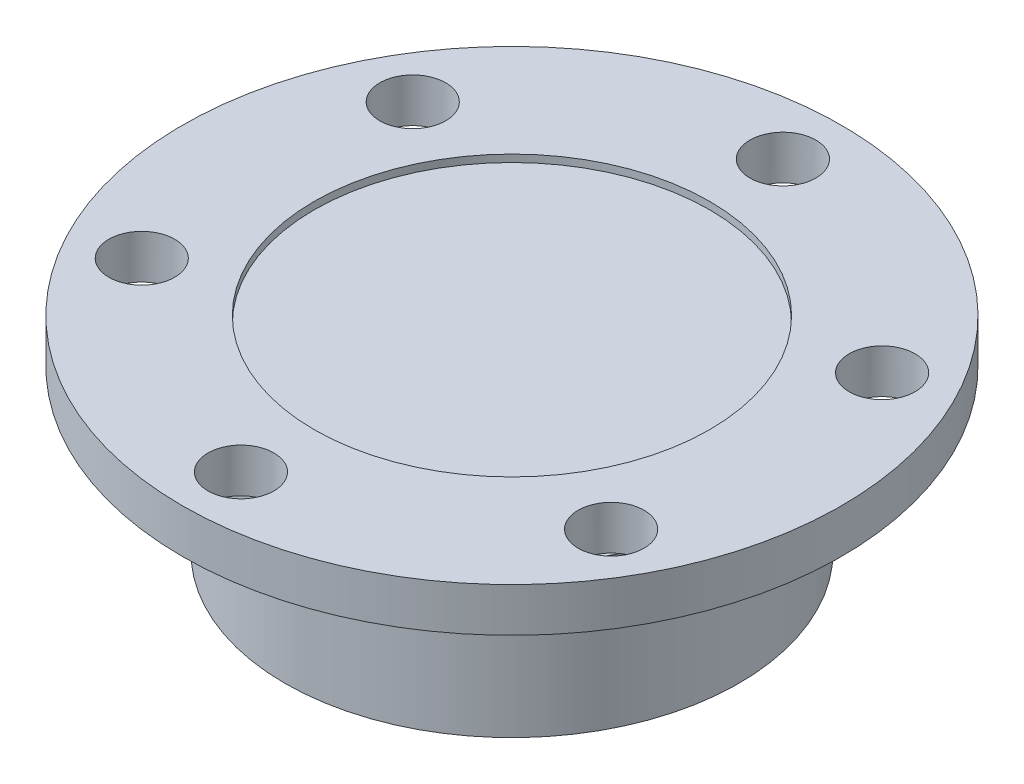
ISO-10303-21;
HEADER;
FILE_DESCRIPTION(('STEP AP214'),'2;1');
FILE_NAME('part.step','',(''),(''),'','','');
FILE_SCHEMA(('AUTOMOTIVE_DESIGN { 1 0 10303 214 1 1 1 1 }'));
ENDSEC;
DATA;
#1=APPLICATION_CONTEXT('core data for automotive mechanical design processes');
#2=APPLICATION_PROTOCOL_DEFINITION('international standard','automotive_design',2000,#1);
#3=PRODUCT_CONTEXT('',#1,'mechanical');
#4=PRODUCT('Part','Part','',(#3));
#5=PRODUCT_RELATED_PRODUCT_CATEGORY('part','',(#4));
#6=PRODUCT_DEFINITION_FORMATION('','',#4);
#7=PRODUCT_DEFINITION_CONTEXT('part definition',#1,'design');
#8=PRODUCT_DEFINITION('design','',#6,#7);
#9=PRODUCT_DEFINITION_SHAPE('','',#8);
#10=(LENGTH_UNIT() NAMED_UNIT(*) SI_UNIT(.MILLI.,.METRE.));
#11=(NAMED_UNIT(*) PLANE_ANGLE_UNIT() SI_UNIT($,.RADIAN.));
#12=(NAMED_UNIT(*) SI_UNIT($,.STERADIAN.) SOLID_ANGLE_UNIT());
#13=UNCERTAINTY_MEASURE_WITH_UNIT(LENGTH_MEASURE(1.E-05),#10,'distance_accuracy_value','');
#14=(GEOMETRIC_REPRESENTATION_CONTEXT(3) GLOBAL_UNCERTAINTY_ASSIGNED_CONTEXT((#13)) GLOBAL_UNIT_ASSIGNED_CONTEXT((#10,
#11,#12)) REPRESENTATION_CONTEXT('',''));
#15=CARTESIAN_POINT('',(0.,0.,0.));
#16=DIRECTION('',(0.,0.,1.));
#17=DIRECTION('',(1.,0.,0.));
#18=AXIS2_PLACEMENT_3D('',#15,#16,#17);
#19=CARTESIAN_POINT('',(-27.,27.,0.));
#20=DIRECTION('',(0.,1.,0.));
#21=DIRECTION('',(0.,0.,1.));
#22=AXIS2_PLACEMENT_3D('',#19,#20,#21);
#23=PLANE('',#22);
#24=CARTESIAN_POINT('',(0.,27.,0.));
#25=DIRECTION('',(0.,1.,0.));
#26=DIRECTION('',(0.,0.,1.));
#27=AXIS2_PLACEMENT_3D('',#24,#25,#26);
#28=CIRCLE('',#27,27.);
#29=CARTESIAN_POINT('',(0.,27.,27.));
#30=VERTEX_POINT('',#29);
#31=EDGE_CURVE('E64',#30,#30,#28,.T.);
#32=ORIENTED_EDGE('',*,*,#31,.T.);
#33=EDGE_LOOP('',(#32));
#34=FACE_BOUND('',#33,.T.);
#35=ADVANCED_FACE('F30',(#34),#23,.T.);
#36=CARTESIAN_POINT('',(-22.,24.5,0.));
#37=DIRECTION('',(0.,-1.,0.));
#38=DIRECTION('',(0.,0.,-1.));
#39=AXIS2_PLACEMENT_3D('',#36,#37,#38);
#40=PLANE('',#39);
#41=CARTESIAN_POINT('',(0.,24.5,0.));
#42=DIRECTION('',(0.,1.,0.));
#43=DIRECTION('',(0.,0.,1.));
#44=AXIS2_PLACEMENT_3D('',#41,#42,#43);
#45=CIRCLE('',#44,22.);
#46=CARTESIAN_POINT('',(0.,24.5,22.));
#47=VERTEX_POINT('',#46);
#48=EDGE_CURVE('E10',#47,#47,#45,.T.);
#49=ORIENTED_EDGE('',*,*,#48,.F.);
#50=EDGE_LOOP('',(#49));
#51=FACE_BOUND('',#50,.T.);
#52=ADVANCED_FACE('F133',(#51),#40,.T.);
#53=CARTESIAN_POINT('',(0.,0.,0.));
#54=DIRECTION('',(0.,-1.,0.));
#55=DIRECTION('',(0.,0.,-1.));
#56=AXIS2_PLACEMENT_3D('',#53,#54,#55);
#57=CONICAL_SURFACE('',#56,26.3200110273573,0.174532925199429);
#58=ORIENTED_EDGE('',*,*,#48,.T.);
#59=EDGE_LOOP('',(#58));
#60=FACE_BOUND('',#59,.T.);
#61=CARTESIAN_POINT('',(0.,0.,0.));
#62=DIRECTION('',(0.,1.,0.));
#63=DIRECTION('',(0.,0.,1.));
#64=AXIS2_PLACEMENT_3D('',#61,#62,#63);
#65=CIRCLE('',#64,26.3200110273573);
#66=CARTESIAN_POINT('',(0.,0.,26.3200110273573));
#67=VERTEX_POINT('',#66);
#68=EDGE_CURVE('E36',#67,#67,#65,.T.);
#69=ORIENTED_EDGE('',*,*,#68,.F.);
#70=EDGE_LOOP('',(#69));
#71=FACE_BOUND('',#70,.T.);
#72=ADVANCED_FACE('F137',(#60,#71),#57,.F.);
#73=CARTESIAN_POINT('',(-31.,0.,0.));
#74=DIRECTION('',(0.,-1.,0.));
#75=DIRECTION('',(0.,0.,-1.));
#76=AXIS2_PLACEMENT_3D('',#73,#74,#75);
#77=PLANE('',#76);
#78=ORIENTED_EDGE('',*,*,#68,.T.);
#79=EDGE_LOOP('',(#78));
#80=FACE_BOUND('',#79,.T.);
#81=CARTESIAN_POINT('',(0.,0.,0.));
#82=DIRECTION('',(0.,1.,0.));
#83=DIRECTION('',(0.,0.,1.));
#84=AXIS2_PLACEMENT_3D('',#81,#82,#83);
#85=CIRCLE('',#84,31.);
#86=CARTESIAN_POINT('',(0.,0.,31.));
#87=VERTEX_POINT('',#86);
#88=EDGE_CURVE('E40',#87,#87,#85,.T.);
#89=ORIENTED_EDGE('',*,*,#88,.F.);
#90=EDGE_LOOP('',(#89));
#91=FACE_BOUND('',#90,.T.);
#92=ADVANCED_FACE('F142',(#80,#91),#77,.T.);
#93=CARTESIAN_POINT('',(0.,30.6187975640425,0.));
#94=DIRECTION('',(0.,1.,0.));
#95=DIRECTION('',(0.,0.,1.));
#96=AXIS2_PLACEMENT_3D('',#93,#94,#95);
#97=CYLINDRICAL_SURFACE('',#96,31.);
#98=ORIENTED_EDGE('',*,*,#88,.T.);
#99=EDGE_LOOP('',(#98));
#100=FACE_BOUND('',#99,.T.);
#101=CARTESIAN_POINT('',(0.,20.5,0.));
#102=DIRECTION('',(0.,1.,0.));
#103=DIRECTION('',(0.,0.,1.));
#104=AXIS2_PLACEMENT_3D('',#101,#102,#103);
#105=CIRCLE('',#104,31.);
#106=CARTESIAN_POINT('',(0.,20.5,31.));
#107=VERTEX_POINT('',#106);
#108=EDGE_CURVE('E44',#107,#107,#105,.T.);
#109=ORIENTED_EDGE('',*,*,#108,.F.);
#110=EDGE_LOOP('',(#109));
#111=FACE_BOUND('',#110,.T.);
#112=ADVANCED_FACE('F147',(#100,#111),#97,.T.);
#113=CARTESIAN_POINT('',(-29.5,20.5,0.));
#114=DIRECTION('',(0.,1.,0.));
#115=DIRECTION('',(0.,0.,1.));
#116=AXIS2_PLACEMENT_3D('',#113,#114,#115);
#117=PLANE('',#116);
#118=ORIENTED_EDGE('',*,*,#108,.T.);
#119=EDGE_LOOP('',(#118));
#120=FACE_BOUND('',#119,.T.);
#121=CARTESIAN_POINT('',(0.,20.5,0.));
#122=DIRECTION('',(0.,1.,0.));
#123=DIRECTION('',(0.,0.,1.));
#124=AXIS2_PLACEMENT_3D('',#121,#122,#123);
#125=CIRCLE('',#124,29.5);
#126=CARTESIAN_POINT('',(0.,20.5,29.5));
#127=VERTEX_POINT('',#126);
#128=EDGE_CURVE('E49',#127,#127,#125,.T.);
#129=ORIENTED_EDGE('',*,*,#128,.F.);
#130=EDGE_LOOP('',(#129));
#131=FACE_BOUND('',#130,.T.);
#132=ADVANCED_FACE('F150',(#120,#131),#117,.T.);
#133=CARTESIAN_POINT('',(0.,30.6187975640425,0.));
#134=DIRECTION('',(0.,1.,0.));
#135=DIRECTION('',(0.,0.,1.));
#136=AXIS2_PLACEMENT_3D('',#133,#134,#135);
#137=CYLINDRICAL_SURFACE('',#136,29.5);
#138=ORIENTED_EDGE('',*,*,#128,.T.);
#139=EDGE_LOOP('',(#138));
#140=FACE_BOUND('',#139,.T.);
#141=CARTESIAN_POINT('',(0.,22.,0.));
#142=DIRECTION('',(0.,1.,0.));
#143=DIRECTION('',(0.,0.,1.));
#144=AXIS2_PLACEMENT_3D('',#141,#142,#143);
#145=CIRCLE('',#144,29.5);
#146=CARTESIAN_POINT('',(0.,22.,29.5));
#147=VERTEX_POINT('',#146);
#148=EDGE_CURVE('E52',#147,#147,#145,.T.);
#149=ORIENTED_EDGE('',*,*,#148,.F.);
#150=EDGE_LOOP('',(#149));
#151=FACE_BOUND('',#150,.T.);
#152=ADVANCED_FACE('F154',(#140,#151),#137,.T.);
#153=CARTESIAN_POINT('',(-45.,22.,0.));
#154=DIRECTION('',(0.,-1.,0.));
#155=DIRECTION('',(0.,0.,-1.));
#156=AXIS2_PLACEMENT_3D('',#153,#154,#155);
#157=PLANE('',#156);
#158=CARTESIAN_POINT('',(0.,22.,-37.));
#159=DIRECTION('',(0.,-1.,0.));
#160=DIRECTION('',(0.,0.,-1.));
#161=AXIS2_PLACEMENT_3D('',#158,#159,#160);
#162=CIRCLE('',#161,4.5);
#163=CARTESIAN_POINT('',(0.,22.,-41.5));
#164=VERTEX_POINT('',#163);
#165=EDGE_CURVE('E93',#164,#164,#162,.F.);
#166=ORIENTED_EDGE('',*,*,#165,.T.);
#167=EDGE_LOOP('',(#166));
#168=FACE_BOUND('',#167,.T.);
#169=CARTESIAN_POINT('',(-32.0429399400232,22.,-18.4999999999982));
#170=DIRECTION('',(0.,-1.,0.));
#171=DIRECTION('',(0.,0.,-1.));
#172=AXIS2_PLACEMENT_3D('',#169,#170,#171);
#173=CIRCLE('',#172,4.50000000000197);
#174=CARTESIAN_POINT('',(-32.0429399400232,22.,-23.0000000000001));
#175=VERTEX_POINT('',#174);
#176=EDGE_CURVE('E94',#175,#175,#173,.F.);
#177=ORIENTED_EDGE('',*,*,#176,.T.);
#178=EDGE_LOOP('',(#177));
#179=FACE_BOUND('',#178,.T.);
#180=CARTESIAN_POINT('',(-32.0429399400211,22.,18.5000000000018));
#181=DIRECTION('',(0.,-1.,0.));
#182=DIRECTION('',(0.,0.,-1.));
#183=AXIS2_PLACEMENT_3D('',#180,#181,#182);
#184=CIRCLE('',#183,4.5000000000039);
#185=CARTESIAN_POINT('',(-32.0429399400211,22.,13.9999999999979));
#186=VERTEX_POINT('',#185);
#187=EDGE_CURVE('E68',#186,#186,#184,.F.);
#188=ORIENTED_EDGE('',*,*,#187,.T.);
#189=EDGE_LOOP('',(#188));
#190=FACE_BOUND('',#189,.T.);
#191=CARTESIAN_POINT('',(4.1990728836402E-12,22.,37.));
#192=DIRECTION('',(0.,-1.,0.));
#193=DIRECTION('',(0.,0.,-1.));
#194=AXIS2_PLACEMENT_3D('',#191,#192,#193);
#195=CIRCLE('',#194,4.50000000000426);
#196=CARTESIAN_POINT('',(4.1990728836402E-12,22.,32.4999999999957));
#197=VERTEX_POINT('',#196);
#198=EDGE_CURVE('E75',#197,#197,#195,.F.);
#199=ORIENTED_EDGE('',*,*,#198,.T.);
#200=EDGE_LOOP('',(#199));
#201=FACE_BOUND('',#200,.T.);
#202=CARTESIAN_POINT('',(32.0429399400274,22.,18.4999999999982));
#203=DIRECTION('',(0.,-1.,0.));
#204=DIRECTION('',(0.,0.,-1.));
#205=AXIS2_PLACEMENT_3D('',#202,#203,#204);
#206=CIRCLE('',#205,4.50000000000265);
#207=CARTESIAN_POINT('',(32.0429399400274,22.,13.9999999999955));
#208=VERTEX_POINT('',#207);
#209=EDGE_CURVE('E81',#208,#208,#206,.F.);
#210=ORIENTED_EDGE('',*,*,#209,.T.);
#211=EDGE_LOOP('',(#210));
#212=FACE_BOUND('',#211,.T.);
#213=CARTESIAN_POINT('',(32.0429399400253,22.,-18.5000000000018));
#214=DIRECTION('',(0.,-1.,0.));
#215=DIRECTION('',(0.,0.,-1.));
#216=AXIS2_PLACEMENT_3D('',#213,#214,#215);
#217=CIRCLE('',#216,4.50000000000057);
#218=CARTESIAN_POINT('',(32.0429399400253,22.,-23.0000000000024));
#219=VERTEX_POINT('',#218);
#220=EDGE_CURVE('E87',#219,#219,#217,.F.);
#221=ORIENTED_EDGE('',*,*,#220,.T.);
#222=EDGE_LOOP('',(#221));
#223=FACE_BOUND('',#222,.T.);
#224=ORIENTED_EDGE('',*,*,#148,.T.);
#225=EDGE_LOOP('',(#224));
#226=FACE_BOUND('',#225,.T.);
#227=CARTESIAN_POINT('',(0.,22.,0.));
#228=DIRECTION('',(0.,1.,0.));
#229=DIRECTION('',(0.,0.,1.));
#230=AXIS2_PLACEMENT_3D('',#227,#228,#229);
#231=CIRCLE('',#230,45.);
#232=CARTESIAN_POINT('',(0.,22.,45.));
#233=VERTEX_POINT('',#232);
#234=EDGE_CURVE('E55',#233,#233,#231,.T.);
#235=ORIENTED_EDGE('',*,*,#234,.F.);
#236=EDGE_LOOP('',(#235));
#237=FACE_BOUND('',#236,.T.);
#238=ADVANCED_FACE('F158',(#168,#179,#190,#201,#212,#223,#226,#237),#157,.T.);
#239=CARTESIAN_POINT('',(0.,30.6187975640425,0.));
#240=DIRECTION('',(0.,1.,0.));
#241=DIRECTION('',(0.,0.,1.));
#242=AXIS2_PLACEMENT_3D('',#239,#240,#241);
#243=CYLINDRICAL_SURFACE('',#242,45.);
#244=ORIENTED_EDGE('',*,*,#234,.T.);
#245=EDGE_LOOP('',(#244));
#246=FACE_BOUND('',#245,.T.);
#247=CARTESIAN_POINT('',(0.,28.,0.));
#248=DIRECTION('',(0.,1.,0.));
#249=DIRECTION('',(0.,0.,1.));
#250=AXIS2_PLACEMENT_3D('',#247,#248,#249);
#251=CIRCLE('',#250,45.);
#252=CARTESIAN_POINT('',(0.,28.,45.));
#253=VERTEX_POINT('',#252);
#254=EDGE_CURVE('E58',#253,#253,#251,.T.);
#255=ORIENTED_EDGE('',*,*,#254,.F.);
#256=EDGE_LOOP('',(#255));
#257=FACE_BOUND('',#256,.T.);
#258=ADVANCED_FACE('F110',(#246,#257),#243,.T.);
#259=CARTESIAN_POINT('',(-45.,28.,0.));
#260=DIRECTION('',(0.,1.,0.));
#261=DIRECTION('',(0.,0.,1.));
#262=AXIS2_PLACEMENT_3D('',#259,#260,#261);
#263=PLANE('',#262);
#264=CARTESIAN_POINT('',(0.,28.,-37.));
#265=DIRECTION('',(0.,1.,0.));
#266=DIRECTION('',(0.,0.,1.));
#267=AXIS2_PLACEMENT_3D('',#264,#265,#266);
#268=CIRCLE('',#267,4.5);
#269=CARTESIAN_POINT('',(0.,28.,-32.5));
#270=VERTEX_POINT('',#269);
#271=EDGE_CURVE('E67',#270,#270,#268,.T.);
#272=ORIENTED_EDGE('',*,*,#271,.F.);
#273=EDGE_LOOP('',(#272));
#274=FACE_BOUND('',#273,.T.);
#275=CARTESIAN_POINT('',(-32.0429399400232,28.,-18.4999999999982));
#276=DIRECTION('',(0.,1.,0.));
#277=DIRECTION('',(0.,0.,1.));
#278=AXIS2_PLACEMENT_3D('',#275,#276,#277);
#279=CIRCLE('',#278,4.50000000000197);
#280=CARTESIAN_POINT('',(-32.0429399400232,28.,-13.9999999999962));
#281=VERTEX_POINT('',#280);
#282=EDGE_CURVE('E72',#281,#281,#279,.T.);
#283=ORIENTED_EDGE('',*,*,#282,.F.);
#284=EDGE_LOOP('',(#283));
#285=FACE_BOUND('',#284,.T.);
#286=CARTESIAN_POINT('',(-32.0429399400211,28.,18.5000000000018));
#287=DIRECTION('',(0.,1.,0.));
#288=DIRECTION('',(0.,0.,1.));
#289=AXIS2_PLACEMENT_3D('',#286,#287,#288);
#290=CIRCLE('',#289,4.5000000000039);
#291=CARTESIAN_POINT('',(-32.0429399400211,28.,23.0000000000057));
#292=VERTEX_POINT('',#291);
#293=EDGE_CURVE('E71',#292,#292,#290,.T.);
#294=ORIENTED_EDGE('',*,*,#293,.F.);
#295=EDGE_LOOP('',(#294));
#296=FACE_BOUND('',#295,.T.);
#297=CARTESIAN_POINT('',(4.1990728836402E-12,28.,37.));
#298=DIRECTION('',(0.,1.,0.));
#299=DIRECTION('',(0.,0.,1.));
#300=AXIS2_PLACEMENT_3D('',#297,#298,#299);
#301=CIRCLE('',#300,4.50000000000426);
#302=CARTESIAN_POINT('',(4.1990728836402E-12,28.,41.5000000000043));
#303=VERTEX_POINT('',#302);
#304=EDGE_CURVE('E78',#303,#303,#301,.T.);
#305=ORIENTED_EDGE('',*,*,#304,.F.);
#306=EDGE_LOOP('',(#305));
#307=FACE_BOUND('',#306,.T.);
#308=CARTESIAN_POINT('',(32.0429399400274,28.,18.4999999999982));
#309=DIRECTION('',(0.,1.,0.));
#310=DIRECTION('',(0.,0.,1.));
#311=AXIS2_PLACEMENT_3D('',#308,#309,#310);
#312=CIRCLE('',#311,4.50000000000265);
#313=CARTESIAN_POINT('',(32.0429399400274,28.,23.0000000000008));
#314=VERTEX_POINT('',#313);
#315=EDGE_CURVE('E84',#314,#314,#312,.T.);
#316=ORIENTED_EDGE('',*,*,#315,.F.);
#317=EDGE_LOOP('',(#316));
#318=FACE_BOUND('',#317,.T.);
#319=CARTESIAN_POINT('',(32.0429399400253,28.,-18.5000000000018));
#320=DIRECTION('',(0.,1.,0.));
#321=DIRECTION('',(0.,0.,1.));
#322=AXIS2_PLACEMENT_3D('',#319,#320,#321);
#323=CIRCLE('',#322,4.50000000000057);
#324=CARTESIAN_POINT('',(32.0429399400253,28.,-14.0000000000013));
#325=VERTEX_POINT('',#324);
#326=EDGE_CURVE('E90',#325,#325,#323,.T.);
#327=ORIENTED_EDGE('',*,*,#326,.F.);
#328=EDGE_LOOP('',(#327));
#329=FACE_BOUND('',#328,.T.);
#330=ORIENTED_EDGE('',*,*,#254,.T.);
#331=EDGE_LOOP('',(#330));
#332=FACE_BOUND('',#331,.T.);
#333=CARTESIAN_POINT('',(0.,28.,0.));
#334=DIRECTION('',(0.,1.,0.));
#335=DIRECTION('',(0.,0.,1.));
#336=AXIS2_PLACEMENT_3D('',#333,#334,#335);
#337=CIRCLE('',#336,27.);
#338=CARTESIAN_POINT('',(0.,28.,27.));
#339=VERTEX_POINT('',#338);
#340=EDGE_CURVE('E61',#339,#339,#337,.T.);
#341=ORIENTED_EDGE('',*,*,#340,.F.);
#342=EDGE_LOOP('',(#341));
#343=FACE_BOUND('',#342,.T.);
#344=ADVANCED_FACE('F106',(#274,#285,#296,#307,#318,#329,#332,#343),#263,.T.);
#345=CARTESIAN_POINT('',(0.,30.6187975640425,0.));
#346=DIRECTION('',(0.,1.,0.));
#347=DIRECTION('',(0.,0.,1.));
#348=AXIS2_PLACEMENT_3D('',#345,#346,#347);
#349=CYLINDRICAL_SURFACE('',#348,27.);
#350=ORIENTED_EDGE('',*,*,#340,.T.);
#351=EDGE_LOOP('',(#350));
#352=FACE_BOUND('',#351,.T.);
#353=ORIENTED_EDGE('',*,*,#31,.F.);
#354=EDGE_LOOP('',(#353));
#355=FACE_BOUND('',#354,.T.);
#356=ADVANCED_FACE('F109',(#352,#355),#349,.F.);
#357=CARTESIAN_POINT('',(32.0429399400253,-0.001000000000001,-18.5000000000018));
#358=DIRECTION('',(0.,1.,0.));
#359=DIRECTION('',(0.,0.,1.));
#360=AXIS2_PLACEMENT_3D('',#357,#358,#359);
#361=CYLINDRICAL_SURFACE('',#360,4.50000000000057);
#362=ORIENTED_EDGE('',*,*,#220,.F.);
#363=EDGE_LOOP('',(#362));
#364=FACE_BOUND('',#363,.T.);
#365=ORIENTED_EDGE('',*,*,#326,.T.);
#366=EDGE_LOOP('',(#365));
#367=FACE_BOUND('',#366,.T.);
#368=ADVANCED_FACE('F128',(#364,#367),#361,.F.);
#369=CARTESIAN_POINT('',(32.0429399400274,-0.001000000000001,18.4999999999982));
#370=DIRECTION('',(0.,1.,0.));
#371=DIRECTION('',(0.,0.,1.));
#372=AXIS2_PLACEMENT_3D('',#369,#370,#371);
#373=CYLINDRICAL_SURFACE('',#372,4.50000000000265);
#374=ORIENTED_EDGE('',*,*,#209,.F.);
#375=EDGE_LOOP('',(#374));
#376=FACE_BOUND('',#375,.T.);
#377=ORIENTED_EDGE('',*,*,#315,.T.);
#378=EDGE_LOOP('',(#377));
#379=FACE_BOUND('',#378,.T.);
#380=ADVANCED_FACE('F174',(#376,#379),#373,.F.);
#381=CARTESIAN_POINT('',(4.1990728836402E-12,-0.001000000000001,37.));
#382=DIRECTION('',(0.,1.,0.));
#383=DIRECTION('',(0.,0.,1.));
#384=AXIS2_PLACEMENT_3D('',#381,#382,#383);
#385=CYLINDRICAL_SURFACE('',#384,4.50000000000426);
#386=ORIENTED_EDGE('',*,*,#198,.F.);
#387=EDGE_LOOP('',(#386));
#388=FACE_BOUND('',#387,.T.);
#389=ORIENTED_EDGE('',*,*,#304,.T.);
#390=EDGE_LOOP('',(#389));
#391=FACE_BOUND('',#390,.T.);
#392=ADVANCED_FACE('F170',(#388,#391),#385,.F.);
#393=CARTESIAN_POINT('',(-32.0429399400211,-0.001000000000001,18.5000000000018));
#394=DIRECTION('',(0.,1.,0.));
#395=DIRECTION('',(0.,0.,1.));
#396=AXIS2_PLACEMENT_3D('',#393,#394,#395);
#397=CYLINDRICAL_SURFACE('',#396,4.5000000000039);
#398=ORIENTED_EDGE('',*,*,#187,.F.);
#399=EDGE_LOOP('',(#398));
#400=FACE_BOUND('',#399,.T.);
#401=ORIENTED_EDGE('',*,*,#293,.T.);
#402=EDGE_LOOP('',(#401));
#403=FACE_BOUND('',#402,.T.);
#404=ADVANCED_FACE('F166',(#400,#403),#397,.F.);
#405=CARTESIAN_POINT('',(-32.0429399400232,-0.001000000000001,-18.4999999999982));
#406=DIRECTION('',(0.,1.,0.));
#407=DIRECTION('',(0.,0.,1.));
#408=AXIS2_PLACEMENT_3D('',#405,#406,#407);
#409=CYLINDRICAL_SURFACE('',#408,4.50000000000197);
#410=ORIENTED_EDGE('',*,*,#176,.F.);
#411=EDGE_LOOP('',(#410));
#412=FACE_BOUND('',#411,.T.);
#413=ORIENTED_EDGE('',*,*,#282,.T.);
#414=EDGE_LOOP('',(#413));
#415=FACE_BOUND('',#414,.T.);
#416=ADVANCED_FACE('F169',(#412,#415),#409,.F.);
#417=CARTESIAN_POINT('',(0.,-0.001000000000001,-37.));
#418=DIRECTION('',(0.,1.,0.));
#419=DIRECTION('',(0.,0.,1.));
#420=AXIS2_PLACEMENT_3D('',#417,#418,#419);
#421=CYLINDRICAL_SURFACE('',#420,4.5);
#422=ORIENTED_EDGE('',*,*,#165,.F.);
#423=EDGE_LOOP('',(#422));
#424=FACE_BOUND('',#423,.T.);
#425=ORIENTED_EDGE('',*,*,#271,.T.);
#426=EDGE_LOOP('',(#425));
#427=FACE_BOUND('',#426,.T.);
#428=ADVANCED_FACE('F104',(#424,#427),#421,.F.);
#429=CLOSED_SHELL('',(#35,#52,#72,#92,#112,#132,#152,#238,#258,#344,#356,#368,#380,#392,#404,
#416,#428));
#430=MANIFOLD_SOLID_BREP('B2',#429);
#431=ADVANCED_BREP_SHAPE_REPRESENTATION('',(#18,#430),#14);
#432=SHAPE_DEFINITION_REPRESENTATION(#9,#431);
ENDSEC;
END-ISO-10303-21;
